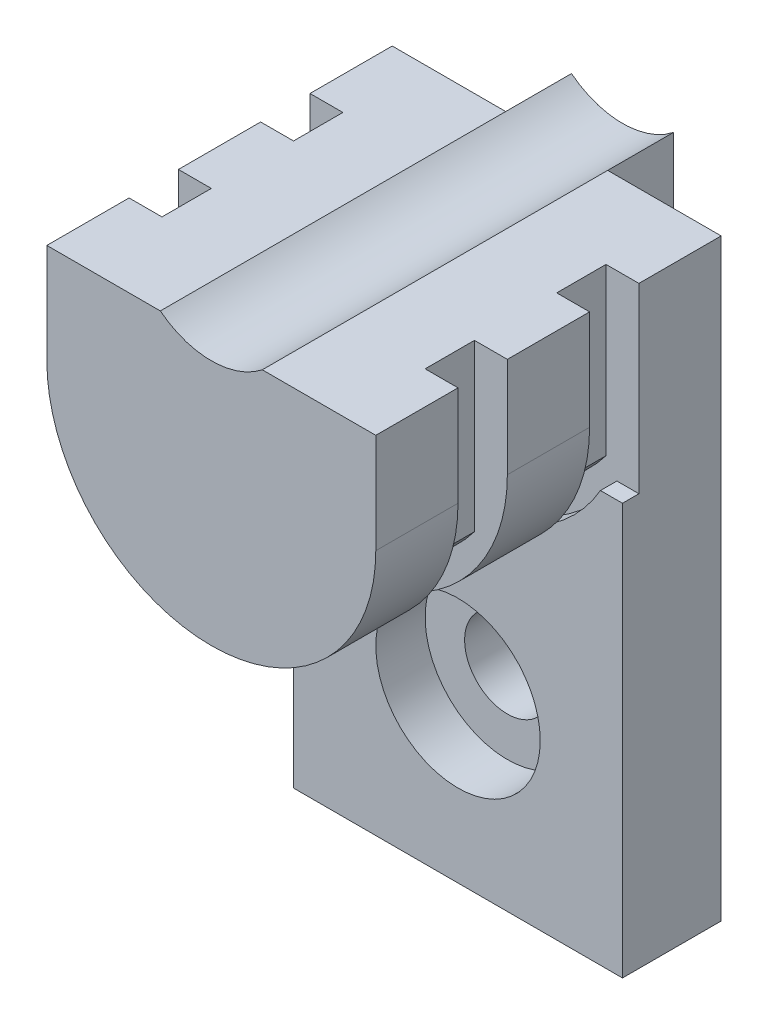
ISO-10303-21;
HEADER;
FILE_DESCRIPTION(('STEP AP214'),'2;1');
FILE_NAME('part.step','',(''),(''),'','','');
FILE_SCHEMA(('AUTOMOTIVE_DESIGN { 1 0 10303 214 1 1 1 1 }'));
ENDSEC;
DATA;
#1=APPLICATION_CONTEXT('core data for automotive mechanical design processes');
#2=APPLICATION_PROTOCOL_DEFINITION('international standard','automotive_design',2000,#1);
#3=PRODUCT_CONTEXT('',#1,'mechanical');
#4=PRODUCT('Part','Part','',(#3));
#5=PRODUCT_RELATED_PRODUCT_CATEGORY('part','',(#4));
#6=PRODUCT_DEFINITION_FORMATION('','',#4);
#7=PRODUCT_DEFINITION_CONTEXT('part definition',#1,'design');
#8=PRODUCT_DEFINITION('design','',#6,#7);
#9=PRODUCT_DEFINITION_SHAPE('','',#8);
#10=(LENGTH_UNIT() NAMED_UNIT(*) SI_UNIT(.MILLI.,.METRE.));
#11=(NAMED_UNIT(*) PLANE_ANGLE_UNIT() SI_UNIT($,.RADIAN.));
#12=(NAMED_UNIT(*) SI_UNIT($,.STERADIAN.) SOLID_ANGLE_UNIT());
#13=UNCERTAINTY_MEASURE_WITH_UNIT(LENGTH_MEASURE(1.E-05),#10,'distance_accuracy_value','');
#14=(GEOMETRIC_REPRESENTATION_CONTEXT(3) GLOBAL_UNCERTAINTY_ASSIGNED_CONTEXT((#13)) GLOBAL_UNIT_ASSIGNED_CONTEXT((#10,
#11,#12)) REPRESENTATION_CONTEXT('',''));
#15=CARTESIAN_POINT('',(0.,0.,0.));
#16=DIRECTION('',(0.,0.,1.));
#17=DIRECTION('',(1.,0.,0.));
#18=AXIS2_PLACEMENT_3D('',#15,#16,#17);
#19=CARTESIAN_POINT('',(-10.,0.,10.));
#20=DIRECTION('',(-1.,0.,0.));
#21=DIRECTION('',(0.,0.,1.));
#22=AXIS2_PLACEMENT_3D('',#19,#20,#21);
#23=PLANE('',#22);
#24=DIRECTION('',(0.,0.,-1.));
#25=VECTOR('',#24,1.);
#26=CARTESIAN_POINT('',(-9.99999999999999,-9.9230090491866,94.));
#27=LINE('',#26,#25);
#28=CARTESIAN_POINT('',(-10.,-9.9230090491866,17.));
#29=VERTEX_POINT('',#28);
#30=CARTESIAN_POINT('',(-10.,-9.9230090491866,12.));
#31=VERTEX_POINT('',#30);
#32=EDGE_CURVE('E954',#29,#31,#27,.T.);
#33=ORIENTED_EDGE('',*,*,#32,.T.);
#34=DIRECTION('',(0.,-1.,0.));
#35=VECTOR('',#34,1.);
#36=CARTESIAN_POINT('',(-10.,-14.0000000000001,12.));
#37=LINE('',#36,#35);
#38=CARTESIAN_POINT('',(-10.,-16.0000000000001,12.));
#39=VERTEX_POINT('',#38);
#40=EDGE_CURVE('E891',#31,#39,#37,.T.);
#41=ORIENTED_EDGE('',*,*,#40,.T.);
#42=DIRECTION('',(0.,0.,1.));
#43=VECTOR('',#42,1.);
#44=CARTESIAN_POINT('',(-10.,-16.0000000000001,12.));
#45=LINE('',#44,#43);
#46=CARTESIAN_POINT('',(-10.,-16.0000000000001,17.));
#47=VERTEX_POINT('',#46);
#48=EDGE_CURVE('E893',#39,#47,#45,.T.);
#49=ORIENTED_EDGE('',*,*,#48,.T.);
#50=DIRECTION('',(0.,1.,0.));
#51=VECTOR('',#50,1.);
#52=CARTESIAN_POINT('',(-10.,-16.,17.));
#53=LINE('',#52,#51);
#54=EDGE_CURVE('E880',#47,#29,#53,.T.);
#55=ORIENTED_EDGE('',*,*,#54,.T.);
#56=EDGE_LOOP('',(#33,#41,#49,#55));
#57=FACE_BOUND('',#56,.T.);
#58=ADVANCED_FACE('F445',(#57),#23,.T.);
#59=CARTESIAN_POINT('',(-10.,-9.9230090491866,9.00000000000002));
#60=VERTEX_POINT('',#59);
#61=CARTESIAN_POINT('',(-10.,-9.9230090491866,4.));
#62=VERTEX_POINT('',#61);
#63=EDGE_CURVE('E956',#60,#62,#27,.T.);
#64=ORIENTED_EDGE('',*,*,#63,.T.);
#65=DIRECTION('',(0.,1.,0.));
#66=VECTOR('',#65,1.);
#67=CARTESIAN_POINT('',(-10.,-22.,4.));
#68=LINE('',#67,#66);
#69=CARTESIAN_POINT('',(-10.,-46.,4.));
#70=VERTEX_POINT('',#69);
#71=EDGE_CURVE('E695',#70,#62,#68,.T.);
#72=ORIENTED_EDGE('',*,*,#71,.F.);
#73=DIRECTION('',(0.,0.,-1.));
#74=VECTOR('',#73,1.);
#75=CARTESIAN_POINT('',(-10.,-46.,10.));
#76=LINE('',#75,#74);
#77=CARTESIAN_POINT('',(-10.,-46.,10.));
#78=VERTEX_POINT('',#77);
#79=EDGE_CURVE('E713',#78,#70,#76,.T.);
#80=ORIENTED_EDGE('',*,*,#79,.F.);
#81=DIRECTION('',(0.,1.,0.));
#82=VECTOR('',#81,1.);
#83=CARTESIAN_POINT('',(-10.,-16.,10.));
#84=LINE('',#83,#82);
#85=CARTESIAN_POINT('',(-10.,-21.,10.));
#86=VERTEX_POINT('',#85);
#87=EDGE_CURVE('E685',#78,#86,#84,.T.);
#88=ORIENTED_EDGE('',*,*,#87,.T.);
#89=DIRECTION('',(0.,0.,1.));
#90=VECTOR('',#89,1.);
#91=CARTESIAN_POINT('',(-10.,-21.,0.));
#92=LINE('',#91,#90);
#93=CARTESIAN_POINT('',(-10.,-21.,9.));
#94=VERTEX_POINT('',#93);
#95=EDGE_CURVE('E823',#94,#86,#92,.T.);
#96=ORIENTED_EDGE('',*,*,#95,.F.);
#97=DIRECTION('',(0.,-1.,0.));
#98=VECTOR('',#97,1.);
#99=CARTESIAN_POINT('',(-10.,-14.,9.));
#100=LINE('',#99,#98);
#101=EDGE_CURVE('E907',#60,#94,#100,.T.);
#102=ORIENTED_EDGE('',*,*,#101,.F.);
#103=EDGE_LOOP('',(#64,#72,#80,#88,#96,#102));
#104=FACE_BOUND('',#103,.T.);
#105=ADVANCED_FACE('F931',(#104),#23,.T.);
#106=CARTESIAN_POINT('',(-9.99999999999999,-9.9230090491866,25.));
#107=VERTEX_POINT('',#106);
#108=CARTESIAN_POINT('',(-9.99999999999999,-9.9230090491866,20.));
#109=VERTEX_POINT('',#108);
#110=EDGE_CURVE('E951',#107,#109,#27,.T.);
#111=ORIENTED_EDGE('',*,*,#110,.T.);
#112=DIRECTION('',(0.,-1.,0.));
#113=VECTOR('',#112,1.);
#114=CARTESIAN_POINT('',(-10.,-14.,20.));
#115=LINE('',#114,#113);
#116=CARTESIAN_POINT('',(-10.,-16.,20.));
#117=VERTEX_POINT('',#116);
#118=EDGE_CURVE('E858',#109,#117,#115,.T.);
#119=ORIENTED_EDGE('',*,*,#118,.T.);
#120=DIRECTION('',(0.,0.,1.));
#121=VECTOR('',#120,1.);
#122=CARTESIAN_POINT('',(-10.,-16.,20.));
#123=LINE('',#122,#121);
#124=CARTESIAN_POINT('',(-10.,-16.,25.));
#125=VERTEX_POINT('',#124);
#126=EDGE_CURVE('E865',#117,#125,#123,.T.);
#127=ORIENTED_EDGE('',*,*,#126,.T.);
#128=DIRECTION('',(0.,-1.,0.));
#129=VECTOR('',#128,1.);
#130=CARTESIAN_POINT('',(-10.,-6.,25.));
#131=LINE('',#130,#129);
#132=EDGE_CURVE('E735',#107,#125,#131,.T.);
#133=ORIENTED_EDGE('',*,*,#132,.F.);
#134=EDGE_LOOP('',(#111,#119,#127,#133));
#135=FACE_BOUND('',#134,.T.);
#136=ADVANCED_FACE('F934',(#135),#23,.T.);
#137=CARTESIAN_POINT('',(10.,0.,4.));
#138=DIRECTION('',(1.,0.,0.));
#139=DIRECTION('',(0.,0.,-1.));
#140=AXIS2_PLACEMENT_3D('',#137,#138,#139);
#141=PLANE('',#140);
#142=DIRECTION('',(0.,0.,-1.));
#143=VECTOR('',#142,1.);
#144=CARTESIAN_POINT('',(10.,-9.9230090491866,94.));
#145=LINE('',#144,#143);
#146=CARTESIAN_POINT('',(10.,-9.9230090491866,17.));
#147=VERTEX_POINT('',#146);
#148=CARTESIAN_POINT('',(10.,-9.9230090491866,12.));
#149=VERTEX_POINT('',#148);
#150=EDGE_CURVE('E667',#147,#149,#145,.T.);
#151=ORIENTED_EDGE('',*,*,#150,.F.);
#152=DIRECTION('',(0.,-1.,0.));
#153=VECTOR('',#152,1.);
#154=CARTESIAN_POINT('',(9.99999999999999,-14.,17.));
#155=LINE('',#154,#153);
#156=CARTESIAN_POINT('',(9.99999999999999,-16.,17.));
#157=VERTEX_POINT('',#156);
#158=EDGE_CURVE('E876',#147,#157,#155,.T.);
#159=ORIENTED_EDGE('',*,*,#158,.T.);
#160=DIRECTION('',(0.,0.,1.));
#161=VECTOR('',#160,1.);
#162=CARTESIAN_POINT('',(9.99999999999999,-16.,12.));
#163=LINE('',#162,#161);
#164=CARTESIAN_POINT('',(9.99999999999999,-16.,12.));
#165=VERTEX_POINT('',#164);
#166=EDGE_CURVE('E896',#165,#157,#163,.T.);
#167=ORIENTED_EDGE('',*,*,#166,.F.);
#168=DIRECTION('',(0.,-1.,0.));
#169=VECTOR('',#168,1.);
#170=CARTESIAN_POINT('',(10.,-14.,12.));
#171=LINE('',#170,#169);
#172=EDGE_CURVE('E886',#149,#165,#171,.T.);
#173=ORIENTED_EDGE('',*,*,#172,.F.);
#174=EDGE_LOOP('',(#151,#159,#167,#173));
#175=FACE_BOUND('',#174,.T.);
#176=ADVANCED_FACE('F942',(#175),#141,.T.);
#177=CARTESIAN_POINT('',(10.,-9.9230090491866,25.));
#178=VERTEX_POINT('',#177);
#179=CARTESIAN_POINT('',(10.,-9.9230090491866,20.));
#180=VERTEX_POINT('',#179);
#181=EDGE_CURVE('E669',#178,#180,#145,.T.);
#182=ORIENTED_EDGE('',*,*,#181,.F.);
#183=DIRECTION('',(0.,-1.,0.));
#184=VECTOR('',#183,1.);
#185=CARTESIAN_POINT('',(10.,-6.,25.));
#186=LINE('',#185,#184);
#187=CARTESIAN_POINT('',(9.99999999999999,-16.,25.));
#188=VERTEX_POINT('',#187);
#189=EDGE_CURVE('E910',#178,#188,#186,.T.);
#190=ORIENTED_EDGE('',*,*,#189,.T.);
#191=DIRECTION('',(0.,0.,1.));
#192=VECTOR('',#191,1.);
#193=CARTESIAN_POINT('',(9.99999999999999,-16.,20.));
#194=LINE('',#193,#192);
#195=CARTESIAN_POINT('',(9.99999999999999,-16.,20.));
#196=VERTEX_POINT('',#195);
#197=EDGE_CURVE('E868',#196,#188,#194,.T.);
#198=ORIENTED_EDGE('',*,*,#197,.F.);
#199=DIRECTION('',(0.,-1.,0.));
#200=VECTOR('',#199,1.);
#201=CARTESIAN_POINT('',(9.99999999999999,-14.,20.));
#202=LINE('',#201,#200);
#203=EDGE_CURVE('E863',#180,#196,#202,.T.);
#204=ORIENTED_EDGE('',*,*,#203,.F.);
#205=EDGE_LOOP('',(#182,#190,#198,#204));
#206=FACE_BOUND('',#205,.T.);
#207=ADVANCED_FACE('F947',(#206),#141,.T.);
#208=CARTESIAN_POINT('',(0.,0.,10.));
#209=DIRECTION('',(0.,0.,1.));
#210=DIRECTION('',(1.,0.,0.));
#211=AXIS2_PLACEMENT_3D('',#208,#209,#210);
#212=PLANE('',#211);
#213=CARTESIAN_POINT('',(0.,-36.,10.));
#214=DIRECTION('',(0.,0.,1.));
#215=DIRECTION('',(1.,0.,0.));
#216=AXIS2_PLACEMENT_3D('',#213,#214,#215);
#217=CIRCLE('',#216,5.);
#218=CARTESIAN_POINT('',(5.,-36.,10.));
#219=VERTEX_POINT('',#218);
#220=EDGE_CURVE('E757',#219,#219,#217,.T.);
#221=ORIENTED_EDGE('',*,*,#220,.F.);
#222=EDGE_LOOP('',(#221));
#223=FACE_BOUND('',#222,.T.);
#224=DIRECTION('',(0.,1.,0.));
#225=VECTOR('',#224,1.);
#226=CARTESIAN_POINT('',(10.,-16.,10.));
#227=LINE('',#226,#225);
#228=CARTESIAN_POINT('',(9.99999999999999,-46.,9.99999999999999));
#229=VERTEX_POINT('',#228);
#230=CARTESIAN_POINT('',(10.,-21.,10.));
#231=VERTEX_POINT('',#230);
#232=EDGE_CURVE('E699',#229,#231,#227,.T.);
#233=ORIENTED_EDGE('',*,*,#232,.T.);
#234=DIRECTION('',(-1.,0.,0.));
#235=VECTOR('',#234,1.);
#236=CARTESIAN_POINT('',(0.,-21.,10.));
#237=LINE('',#236,#235);
#238=CARTESIAN_POINT('',(8.66025403784438,-21.,10.));
#239=VERTEX_POINT('',#238);
#240=EDGE_CURVE('E846',#231,#239,#237,.T.);
#241=ORIENTED_EDGE('',*,*,#240,.T.);
#242=CARTESIAN_POINT('',(0.,-16.,10.));
#243=DIRECTION('',(0.,0.,1.));
#244=DIRECTION('',(1.,0.,0.));
#245=AXIS2_PLACEMENT_3D('',#242,#243,#244);
#246=CIRCLE('',#245,10.);
#247=CARTESIAN_POINT('',(-8.66025403784439,-21.,10.));
#248=VERTEX_POINT('',#247);
#249=EDGE_CURVE('E909',#248,#239,#246,.T.);
#250=ORIENTED_EDGE('',*,*,#249,.F.);
#251=DIRECTION('',(-1.,0.,0.));
#252=VECTOR('',#251,1.);
#253=CARTESIAN_POINT('',(0.,-21.,10.));
#254=LINE('',#253,#252);
#255=EDGE_CURVE('E838',#248,#86,#254,.T.);
#256=ORIENTED_EDGE('',*,*,#255,.T.);
#257=ORIENTED_EDGE('',*,*,#87,.F.);
#258=DIRECTION('',(1.,0.,0.));
#259=VECTOR('',#258,1.);
#260=CARTESIAN_POINT('',(-10.,-46.,10.));
#261=LINE('',#260,#259);
#262=EDGE_CURVE('E688',#78,#229,#261,.T.);
#263=ORIENTED_EDGE('',*,*,#262,.T.);
#264=EDGE_LOOP('',(#233,#241,#250,#256,#257,#263));
#265=FACE_BOUND('',#264,.T.);
#266=ADVANCED_FACE('F1033',(#223,#265),#212,.T.);
#267=CARTESIAN_POINT('',(0.,-16.,9.));
#268=DIRECTION('',(0.,0.,1.));
#269=DIRECTION('',(1.,0.,0.));
#270=AXIS2_PLACEMENT_3D('',#267,#268,#269);
#271=CYLINDRICAL_SURFACE('',#270,10.);
#272=DIRECTION('',(0.,0.,1.));
#273=VECTOR('',#272,1.);
#274=CARTESIAN_POINT('',(8.66025403784438,-21.,9.));
#275=LINE('',#274,#273);
#276=CARTESIAN_POINT('',(8.66025403784438,-21.,9.));
#277=VERTEX_POINT('',#276);
#278=EDGE_CURVE('E844',#277,#239,#275,.T.);
#279=ORIENTED_EDGE('',*,*,#278,.F.);
#280=CARTESIAN_POINT('',(0.,-16.,9.));
#281=DIRECTION('',(0.,0.,1.));
#282=DIRECTION('',(1.,0.,0.));
#283=AXIS2_PLACEMENT_3D('',#280,#281,#282);
#284=CIRCLE('',#283,10.);
#285=CARTESIAN_POINT('',(-8.66025403784439,-21.,9.));
#286=VERTEX_POINT('',#285);
#287=EDGE_CURVE('E899',#286,#277,#284,.T.);
#288=ORIENTED_EDGE('',*,*,#287,.F.);
#289=DIRECTION('',(0.,0.,1.));
#290=VECTOR('',#289,1.);
#291=CARTESIAN_POINT('',(-8.66025403784439,-21.,9.));
#292=LINE('',#291,#290);
#293=EDGE_CURVE('E836',#248,#286,#292,.F.);
#294=ORIENTED_EDGE('',*,*,#293,.F.);
#295=ORIENTED_EDGE('',*,*,#249,.T.);
#296=EDGE_LOOP('',(#279,#288,#294,#295));
#297=FACE_BOUND('',#296,.T.);
#298=ADVANCED_FACE('F1036',(#297),#271,.F.);
#299=CARTESIAN_POINT('',(0.,-14.,17.));
#300=DIRECTION('',(0.,0.,1.));
#301=DIRECTION('',(1.,0.,0.));
#302=AXIS2_PLACEMENT_3D('',#299,#300,#301);
#303=CYLINDRICAL_SURFACE('',#302,10.);
#304=CARTESIAN_POINT('',(0.,-14.,20.));
#305=DIRECTION('',(0.,0.,-1.));
#306=DIRECTION('',(-1.,0.,0.));
#307=AXIS2_PLACEMENT_3D('',#304,#305,#306);
#308=CIRCLE('',#307,10.);
#309=CARTESIAN_POINT('',(8.,-20.,20.));
#310=VERTEX_POINT('',#309);
#311=CARTESIAN_POINT('',(-8.,-20.,20.));
#312=VERTEX_POINT('',#311);
#313=EDGE_CURVE('E855',#310,#312,#308,.T.);
#314=ORIENTED_EDGE('',*,*,#313,.T.);
#315=DIRECTION('',(0.,0.,1.));
#316=VECTOR('',#315,1.);
#317=CARTESIAN_POINT('',(-8.,-20.,17.));
#318=LINE('',#317,#316);
#319=CARTESIAN_POINT('',(-8.,-20.,17.));
#320=VERTEX_POINT('',#319);
#321=EDGE_CURVE('E833',#312,#320,#318,.F.);
#322=ORIENTED_EDGE('',*,*,#321,.T.);
#323=CARTESIAN_POINT('',(0.,-14.,17.));
#324=DIRECTION('',(0.,0.,1.));
#325=DIRECTION('',(1.,0.,0.));
#326=AXIS2_PLACEMENT_3D('',#323,#324,#325);
#327=CIRCLE('',#326,10.);
#328=CARTESIAN_POINT('',(8.,-20.,17.));
#329=VERTEX_POINT('',#328);
#330=EDGE_CURVE('E871',#320,#329,#327,.T.);
#331=ORIENTED_EDGE('',*,*,#330,.T.);
#332=DIRECTION('',(0.,0.,1.));
#333=VECTOR('',#332,1.);
#334=CARTESIAN_POINT('',(8.,-20.,17.));
#335=LINE('',#334,#333);
#336=EDGE_CURVE('E829',#310,#329,#335,.F.);
#337=ORIENTED_EDGE('',*,*,#336,.F.);
#338=EDGE_LOOP('',(#314,#322,#331,#337));
#339=FACE_BOUND('',#338,.T.);
#340=ADVANCED_FACE('F1092',(#339),#303,.T.);
#341=CARTESIAN_POINT('',(0.,-6.,25.));
#342=DIRECTION('',(0.,0.,1.));
#343=DIRECTION('',(1.,0.,0.));
#344=AXIS2_PLACEMENT_3D('',#341,#342,#343);
#345=PLANE('',#344);
#346=DIRECTION('',(1.,0.,0.));
#347=VECTOR('',#346,1.);
#348=CARTESIAN_POINT('',(0.,-9.9230090491866,25.));
#349=LINE('',#348,#347);
#350=CARTESIAN_POINT('',(-3.1,-9.9230090491866,25.));
#351=VERTEX_POINT('',#350);
#352=EDGE_CURVE('E974',#107,#351,#349,.T.);
#353=ORIENTED_EDGE('',*,*,#352,.F.);
#354=ORIENTED_EDGE('',*,*,#132,.T.);
#355=CARTESIAN_POINT('',(0.,-16.,25.));
#356=DIRECTION('',(0.,0.,-1.));
#357=DIRECTION('',(-1.,0.,0.));
#358=AXIS2_PLACEMENT_3D('',#355,#356,#357);
#359=CIRCLE('',#358,9.99999999999999);
#360=EDGE_CURVE('E854',#188,#125,#359,.T.);
#361=ORIENTED_EDGE('',*,*,#360,.F.);
#362=ORIENTED_EDGE('',*,*,#189,.F.);
#363=CARTESIAN_POINT('',(3.10000000000001,-9.9230090491866,25.));
#364=VERTEX_POINT('',#363);
#365=EDGE_CURVE('E797',#364,#178,#349,.T.);
#366=ORIENTED_EDGE('',*,*,#365,.F.);
#367=CARTESIAN_POINT('',(0.,-6.,25.));
#368=DIRECTION('',(0.,0.,1.));
#369=DIRECTION('',(1.,0.,0.));
#370=AXIS2_PLACEMENT_3D('',#367,#368,#369);
#371=CIRCLE('',#370,5.);
#372=EDGE_CURVE('E852',#351,#364,#371,.T.);
#373=ORIENTED_EDGE('',*,*,#372,.F.);
#374=EDGE_LOOP('',(#353,#354,#361,#362,#366,#373));
#375=FACE_BOUND('',#374,.T.);
#376=ADVANCED_FACE('F972',(#375),#345,.T.);
#377=CARTESIAN_POINT('',(0.,-16.,12.));
#378=DIRECTION('',(0.,0.,1.));
#379=DIRECTION('',(1.,0.,0.));
#380=AXIS2_PLACEMENT_3D('',#377,#378,#379);
#381=CYLINDRICAL_SURFACE('',#380,9.99999999999999);
#382=ORIENTED_EDGE('',*,*,#166,.T.);
#383=CARTESIAN_POINT('',(0.,-16.,17.));
#384=DIRECTION('',(0.,0.,-1.));
#385=DIRECTION('',(-1.,0.,0.));
#386=AXIS2_PLACEMENT_3D('',#383,#384,#385);
#387=CIRCLE('',#386,9.99999999999999);
#388=EDGE_CURVE('E878',#157,#47,#387,.T.);
#389=ORIENTED_EDGE('',*,*,#388,.T.);
#390=ORIENTED_EDGE('',*,*,#48,.F.);
#391=CARTESIAN_POINT('',(0.,-16.,12.));
#392=DIRECTION('',(0.,0.,1.));
#393=DIRECTION('',(1.,0.,0.));
#394=AXIS2_PLACEMENT_3D('',#391,#392,#393);
#395=CIRCLE('',#394,9.99999999999999);
#396=EDGE_CURVE('E888',#39,#165,#395,.T.);
#397=ORIENTED_EDGE('',*,*,#396,.T.);
#398=EDGE_LOOP('',(#382,#389,#390,#397));
#399=FACE_BOUND('',#398,.T.);
#400=ADVANCED_FACE('F1010',(#399),#381,.T.);
#401=CARTESIAN_POINT('',(0.,-14.,9.));
#402=DIRECTION('',(0.,0.,1.));
#403=DIRECTION('',(1.,0.,0.));
#404=AXIS2_PLACEMENT_3D('',#401,#402,#403);
#405=CYLINDRICAL_SURFACE('',#404,10.);
#406=CARTESIAN_POINT('',(0.,-14.,9.));
#407=DIRECTION('',(0.,0.,-1.));
#408=DIRECTION('',(-1.,0.,0.));
#409=AXIS2_PLACEMENT_3D('',#406,#407,#408);
#410=CIRCLE('',#409,10.);
#411=CARTESIAN_POINT('',(8.,-20.,9.));
#412=VERTEX_POINT('',#411);
#413=CARTESIAN_POINT('',(-8.,-20.,9.));
#414=VERTEX_POINT('',#413);
#415=EDGE_CURVE('E904',#412,#414,#410,.T.);
#416=ORIENTED_EDGE('',*,*,#415,.F.);
#417=DIRECTION('',(0.,0.,1.));
#418=VECTOR('',#417,1.);
#419=CARTESIAN_POINT('',(8.,-20.,9.));
#420=LINE('',#419,#418);
#421=CARTESIAN_POINT('',(8.,-20.,12.));
#422=VERTEX_POINT('',#421);
#423=EDGE_CURVE('E849',#412,#422,#420,.T.);
#424=ORIENTED_EDGE('',*,*,#423,.T.);
#425=CARTESIAN_POINT('',(0.,-14.,12.));
#426=DIRECTION('',(0.,0.,1.));
#427=DIRECTION('',(1.,0.,0.));
#428=AXIS2_PLACEMENT_3D('',#425,#426,#427);
#429=CIRCLE('',#428,10.);
#430=CARTESIAN_POINT('',(-8.,-20.,12.));
#431=VERTEX_POINT('',#430);
#432=EDGE_CURVE('E883',#431,#422,#429,.T.);
#433=ORIENTED_EDGE('',*,*,#432,.F.);
#434=DIRECTION('',(0.,0.,1.));
#435=VECTOR('',#434,1.);
#436=CARTESIAN_POINT('',(-8.,-20.,9.));
#437=LINE('',#436,#435);
#438=EDGE_CURVE('E841',#431,#414,#437,.F.);
#439=ORIENTED_EDGE('',*,*,#438,.T.);
#440=EDGE_LOOP('',(#416,#424,#433,#439));
#441=FACE_BOUND('',#440,.T.);
#442=ADVANCED_FACE('F1023',(#441),#405,.T.);
#443=CARTESIAN_POINT('',(10.,-9.9230090491866,9.00000000000002));
#444=VERTEX_POINT('',#443);
#445=CARTESIAN_POINT('',(10.,-9.9230090491866,4.));
#446=VERTEX_POINT('',#445);
#447=EDGE_CURVE('E657',#444,#446,#145,.T.);
#448=ORIENTED_EDGE('',*,*,#447,.F.);
#449=DIRECTION('',(0.,1.,0.));
#450=VECTOR('',#449,1.);
#451=CARTESIAN_POINT('',(10.,-14.,9.));
#452=LINE('',#451,#450);
#453=CARTESIAN_POINT('',(10.,-21.,9.));
#454=VERTEX_POINT('',#453);
#455=EDGE_CURVE('E902',#454,#444,#452,.T.);
#456=ORIENTED_EDGE('',*,*,#455,.F.);
#457=DIRECTION('',(0.,0.,-1.));
#458=VECTOR('',#457,1.);
#459=CARTESIAN_POINT('',(10.,-21.,0.));
#460=LINE('',#459,#458);
#461=EDGE_CURVE('E813',#231,#454,#460,.T.);
#462=ORIENTED_EDGE('',*,*,#461,.F.);
#463=ORIENTED_EDGE('',*,*,#232,.F.);
#464=DIRECTION('',(0.,0.,-1.));
#465=VECTOR('',#464,1.);
#466=CARTESIAN_POINT('',(9.99999999999999,-46.,9.99999999999999));
#467=LINE('',#466,#465);
#468=CARTESIAN_POINT('',(9.99999999999999,-46.,4.));
#469=VERTEX_POINT('',#468);
#470=EDGE_CURVE('E684',#229,#469,#467,.T.);
#471=ORIENTED_EDGE('',*,*,#470,.T.);
#472=DIRECTION('',(0.,1.,0.));
#473=VECTOR('',#472,1.);
#474=CARTESIAN_POINT('',(10.,0.,4.));
#475=LINE('',#474,#473);
#476=EDGE_CURVE('E676',#469,#446,#475,.T.);
#477=ORIENTED_EDGE('',*,*,#476,.T.);
#478=EDGE_LOOP('',(#448,#456,#462,#463,#471,#477));
#479=FACE_BOUND('',#478,.T.);
#480=ADVANCED_FACE('F682',(#479),#141,.T.);
#481=CARTESIAN_POINT('',(0.,0.,0.));
#482=DIRECTION('',(0.,0.,1.));
#483=DIRECTION('',(1.,0.,0.));
#484=AXIS2_PLACEMENT_3D('',#481,#482,#483);
#485=PLANE('',#484);
#486=DIRECTION('',(0.,1.,0.));
#487=VECTOR('',#486,1.);
#488=CARTESIAN_POINT('',(-3.1,-22.,0.));
#489=LINE('',#488,#487);
#490=CARTESIAN_POINT('',(-3.1,-32.9,0.));
#491=VERTEX_POINT('',#490);
#492=CARTESIAN_POINT('',(-3.1,-9.9230090491866,0.));
#493=VERTEX_POINT('',#492);
#494=EDGE_CURVE('E705',#491,#493,#489,.T.);
#495=ORIENTED_EDGE('',*,*,#494,.T.);
#496=CARTESIAN_POINT('',(0.,-6.,0.));
#497=DIRECTION('',(0.,0.,1.));
#498=DIRECTION('',(1.,0.,0.));
#499=AXIS2_PLACEMENT_3D('',#496,#497,#498);
#500=CIRCLE('',#499,5.);
#501=CARTESIAN_POINT('',(3.1,-9.92300904918661,0.));
#502=VERTEX_POINT('',#501);
#503=EDGE_CURVE('E772',#493,#502,#500,.T.);
#504=ORIENTED_EDGE('',*,*,#503,.T.);
#505=DIRECTION('',(0.,1.,0.));
#506=VECTOR('',#505,1.);
#507=CARTESIAN_POINT('',(3.1,-22.,0.));
#508=LINE('',#507,#506);
#509=CARTESIAN_POINT('',(3.1,-32.9,0.));
#510=VERTEX_POINT('',#509);
#511=EDGE_CURVE('E724',#510,#502,#508,.T.);
#512=ORIENTED_EDGE('',*,*,#511,.F.);
#513=DIRECTION('',(-1.,0.,0.));
#514=VECTOR('',#513,1.);
#515=CARTESIAN_POINT('',(0.,-32.9,0.));
#516=LINE('',#515,#514);
#517=EDGE_CURVE('E725',#510,#491,#516,.T.);
#518=ORIENTED_EDGE('',*,*,#517,.T.);
#519=EDGE_LOOP('',(#495,#504,#512,#518));
#520=FACE_BOUND('',#519,.T.);
#521=ADVANCED_FACE('F785',(#520),#485,.F.);
#522=CARTESIAN_POINT('',(0.,-22.,4.));
#523=DIRECTION('',(0.,0.,-1.));
#524=DIRECTION('',(-1.,0.,0.));
#525=AXIS2_PLACEMENT_3D('',#522,#523,#524);
#526=PLANE('',#525);
#527=DIRECTION('',(-1.,0.,0.));
#528=VECTOR('',#527,1.);
#529=CARTESIAN_POINT('',(-3.1,-9.9230090491866,4.));
#530=LINE('',#529,#528);
#531=CARTESIAN_POINT('',(3.1,-9.9230090491866,4.));
#532=VERTEX_POINT('',#531);
#533=EDGE_CURVE('E660',#446,#532,#530,.T.);
#534=ORIENTED_EDGE('',*,*,#533,.F.);
#535=ORIENTED_EDGE('',*,*,#476,.F.);
#536=DIRECTION('',(1.,0.,0.));
#537=VECTOR('',#536,1.);
#538=CARTESIAN_POINT('',(-10.,-46.,4.));
#539=LINE('',#538,#537);
#540=CARTESIAN_POINT('',(3.1,-46.,4.));
#541=VERTEX_POINT('',#540);
#542=EDGE_CURVE('E711',#541,#469,#539,.T.);
#543=ORIENTED_EDGE('',*,*,#542,.F.);
#544=DIRECTION('',(0.,-1.,0.));
#545=VECTOR('',#544,1.);
#546=CARTESIAN_POINT('',(3.1,0.,4.));
#547=LINE('',#546,#545);
#548=CARTESIAN_POINT('',(3.1,-39.1,4.));
#549=VERTEX_POINT('',#548);
#550=EDGE_CURVE('E736',#549,#541,#547,.T.);
#551=ORIENTED_EDGE('',*,*,#550,.F.);
#552=DIRECTION('',(-1.,0.,0.));
#553=VECTOR('',#552,1.);
#554=CARTESIAN_POINT('',(0.,-39.1,4.));
#555=LINE('',#554,#553);
#556=CARTESIAN_POINT('',(-3.1,-39.1,4.));
#557=VERTEX_POINT('',#556);
#558=EDGE_CURVE('E732',#549,#557,#555,.T.);
#559=ORIENTED_EDGE('',*,*,#558,.T.);
#560=DIRECTION('',(0.,-1.,0.));
#561=VECTOR('',#560,1.);
#562=CARTESIAN_POINT('',(-3.1,0.,4.));
#563=LINE('',#562,#561);
#564=CARTESIAN_POINT('',(-3.1,-46.,4.));
#565=VERTEX_POINT('',#564);
#566=EDGE_CURVE('E697',#557,#565,#563,.T.);
#567=ORIENTED_EDGE('',*,*,#566,.T.);
#568=EDGE_CURVE('E708',#70,#565,#539,.T.);
#569=ORIENTED_EDGE('',*,*,#568,.F.);
#570=ORIENTED_EDGE('',*,*,#71,.T.);
#571=CARTESIAN_POINT('',(-3.1,-9.9230090491866,4.));
#572=VERTEX_POINT('',#571);
#573=EDGE_CURVE('E680',#572,#62,#530,.T.);
#574=ORIENTED_EDGE('',*,*,#573,.F.);
#575=DIRECTION('',(0.,1.,0.));
#576=VECTOR('',#575,1.);
#577=CARTESIAN_POINT('',(-3.1,-22.,4.));
#578=LINE('',#577,#576);
#579=CARTESIAN_POINT('',(-3.1,-32.9,4.));
#580=VERTEX_POINT('',#579);
#581=EDGE_CURVE('E693',#580,#572,#578,.T.);
#582=ORIENTED_EDGE('',*,*,#581,.F.);
#583=DIRECTION('',(-1.,0.,0.));
#584=VECTOR('',#583,1.);
#585=CARTESIAN_POINT('',(0.,-32.9,4.));
#586=LINE('',#585,#584);
#587=CARTESIAN_POINT('',(3.1,-32.9,4.));
#588=VERTEX_POINT('',#587);
#589=EDGE_CURVE('E716',#588,#580,#586,.T.);
#590=ORIENTED_EDGE('',*,*,#589,.F.);
#591=DIRECTION('',(0.,1.,0.));
#592=VECTOR('',#591,1.);
#593=CARTESIAN_POINT('',(3.1,-22.,4.));
#594=LINE('',#593,#592);
#595=EDGE_CURVE('E679',#588,#532,#594,.T.);
#596=ORIENTED_EDGE('',*,*,#595,.T.);
#597=EDGE_LOOP('',(#534,#535,#543,#551,#559,#567,#569,#570,#574,#582,#590,#596));
#598=FACE_BOUND('',#597,.T.);
#599=CARTESIAN_POINT('',(0.,-36.,4.));
#600=DIRECTION('',(0.,0.,-1.));
#601=DIRECTION('',(-1.,0.,0.));
#602=AXIS2_PLACEMENT_3D('',#599,#600,#601);
#603=CIRCLE('',#602,2.6);
#604=CARTESIAN_POINT('',(-2.6,-36.,4.));
#605=VERTEX_POINT('',#604);
#606=EDGE_CURVE('E702',#605,#605,#603,.T.);
#607=ORIENTED_EDGE('',*,*,#606,.F.);
#608=EDGE_LOOP('',(#607));
#609=FACE_BOUND('',#608,.T.);
#610=ADVANCED_FACE('F673',(#598,#609),#526,.T.);
#611=CARTESIAN_POINT('',(0.,-36.,10.));
#612=DIRECTION('',(0.,0.,-1.));
#613=DIRECTION('',(-1.,0.,0.));
#614=AXIS2_PLACEMENT_3D('',#611,#612,#613);
#615=CYLINDRICAL_SURFACE('',#614,2.6);
#616=ORIENTED_EDGE('',*,*,#606,.T.);
#617=EDGE_LOOP('',(#616));
#618=FACE_BOUND('',#617,.T.);
#619=CARTESIAN_POINT('',(0.,-36.,7.));
#620=DIRECTION('',(0.,0.,1.));
#621=DIRECTION('',(1.,0.,0.));
#622=AXIS2_PLACEMENT_3D('',#619,#620,#621);
#623=CIRCLE('',#622,2.6);
#624=CARTESIAN_POINT('',(2.6,-36.,7.));
#625=VERTEX_POINT('',#624);
#626=EDGE_CURVE('E760',#625,#625,#623,.F.);
#627=ORIENTED_EDGE('',*,*,#626,.F.);
#628=EDGE_LOOP('',(#627));
#629=FACE_BOUND('',#628,.T.);
#630=ADVANCED_FACE('F918',(#618,#629),#615,.F.);
#631=CARTESIAN_POINT('',(3.1,-22.,0.));
#632=DIRECTION('',(1.,0.,0.));
#633=DIRECTION('',(0.,0.,-1.));
#634=AXIS2_PLACEMENT_3D('',#631,#632,#633);
#635=PLANE('',#634);
#636=DIRECTION('',(0.,0.,1.));
#637=VECTOR('',#636,1.);
#638=CARTESIAN_POINT('',(3.1,-9.92300904918661,-5.));
#639=LINE('',#638,#637);
#640=EDGE_CURVE('E791',#532,#502,#639,.F.);
#641=ORIENTED_EDGE('',*,*,#640,.F.);
#642=ORIENTED_EDGE('',*,*,#595,.F.);
#643=DIRECTION('',(0.,0.,-1.));
#644=VECTOR('',#643,1.);
#645=CARTESIAN_POINT('',(3.1,-32.9,4.));
#646=LINE('',#645,#644);
#647=EDGE_CURVE('E721',#588,#510,#646,.T.);
#648=ORIENTED_EDGE('',*,*,#647,.T.);
#649=ORIENTED_EDGE('',*,*,#511,.T.);
#650=EDGE_LOOP('',(#641,#642,#648,#649));
#651=FACE_BOUND('',#650,.T.);
#652=ADVANCED_FACE('F790',(#651),#635,.T.);
#653=CARTESIAN_POINT('',(-3.1,-22.,0.));
#654=DIRECTION('',(-1.,0.,0.));
#655=DIRECTION('',(0.,0.,1.));
#656=AXIS2_PLACEMENT_3D('',#653,#654,#655);
#657=PLANE('',#656);
#658=DIRECTION('',(0.,0.,1.));
#659=VECTOR('',#658,1.);
#660=CARTESIAN_POINT('',(-3.1,-9.9230090491866,-5.));
#661=LINE('',#660,#659);
#662=EDGE_CURVE('E453',#493,#572,#661,.T.);
#663=ORIENTED_EDGE('',*,*,#662,.F.);
#664=ORIENTED_EDGE('',*,*,#494,.F.);
#665=DIRECTION('',(0.,0.,-1.));
#666=VECTOR('',#665,1.);
#667=CARTESIAN_POINT('',(-3.1,-32.9,4.));
#668=LINE('',#667,#666);
#669=EDGE_CURVE('E717',#580,#491,#668,.T.);
#670=ORIENTED_EDGE('',*,*,#669,.F.);
#671=ORIENTED_EDGE('',*,*,#581,.T.);
#672=EDGE_LOOP('',(#663,#664,#670,#671));
#673=FACE_BOUND('',#672,.T.);
#674=ADVANCED_FACE('F776',(#673),#657,.T.);
#675=CARTESIAN_POINT('',(-10.,-46.,10.));
#676=DIRECTION('',(0.,1.,0.));
#677=DIRECTION('',(0.,0.,1.));
#678=AXIS2_PLACEMENT_3D('',#675,#676,#677);
#679=PLANE('',#678);
#680=ORIENTED_EDGE('',*,*,#568,.T.);
#681=DIRECTION('',(0.,0.,-1.));
#682=VECTOR('',#681,1.);
#683=CARTESIAN_POINT('',(-3.1,-46.,4.));
#684=LINE('',#683,#682);
#685=CARTESIAN_POINT('',(-3.1,-46.,0.));
#686=VERTEX_POINT('',#685);
#687=EDGE_CURVE('E710',#565,#686,#684,.T.);
#688=ORIENTED_EDGE('',*,*,#687,.T.);
#689=DIRECTION('',(-1.,0.,0.));
#690=VECTOR('',#689,1.);
#691=CARTESIAN_POINT('',(0.,-46.,0.));
#692=LINE('',#691,#690);
#693=CARTESIAN_POINT('',(3.1,-46.,0.));
#694=VERTEX_POINT('',#693);
#695=EDGE_CURVE('E748',#694,#686,#692,.T.);
#696=ORIENTED_EDGE('',*,*,#695,.F.);
#697=DIRECTION('',(0.,0.,-1.));
#698=VECTOR('',#697,1.);
#699=CARTESIAN_POINT('',(3.1,-46.,4.));
#700=LINE('',#699,#698);
#701=EDGE_CURVE('E738',#541,#694,#700,.T.);
#702=ORIENTED_EDGE('',*,*,#701,.F.);
#703=ORIENTED_EDGE('',*,*,#542,.T.);
#704=ORIENTED_EDGE('',*,*,#470,.F.);
#705=ORIENTED_EDGE('',*,*,#262,.F.);
#706=ORIENTED_EDGE('',*,*,#79,.T.);
#707=EDGE_LOOP('',(#680,#688,#696,#702,#703,#704,#705,#706));
#708=FACE_BOUND('',#707,.T.);
#709=ADVANCED_FACE('F1046',(#708),#679,.F.);
#710=CARTESIAN_POINT('',(0.,-32.9,4.));
#711=DIRECTION('',(0.,-1.,0.));
#712=DIRECTION('',(0.,0.,-1.));
#713=AXIS2_PLACEMENT_3D('',#710,#711,#712);
#714=PLANE('',#713);
#715=ORIENTED_EDGE('',*,*,#517,.F.);
#716=ORIENTED_EDGE('',*,*,#647,.F.);
#717=ORIENTED_EDGE('',*,*,#589,.T.);
#718=ORIENTED_EDGE('',*,*,#669,.T.);
#719=EDGE_LOOP('',(#715,#716,#717,#718));
#720=FACE_BOUND('',#719,.T.);
#721=ADVANCED_FACE('F788',(#720),#714,.T.);
#722=CARTESIAN_POINT('',(-3.1,0.,4.));
#723=DIRECTION('',(1.,0.,0.));
#724=DIRECTION('',(0.,0.,-1.));
#725=AXIS2_PLACEMENT_3D('',#722,#723,#724);
#726=PLANE('',#725);
#727=DIRECTION('',(0.,-1.,0.));
#728=VECTOR('',#727,1.);
#729=CARTESIAN_POINT('',(-3.1,0.,0.));
#730=LINE('',#729,#728);
#731=CARTESIAN_POINT('',(-3.1,-39.1,0.));
#732=VERTEX_POINT('',#731);
#733=EDGE_CURVE('E720',#732,#686,#730,.T.);
#734=ORIENTED_EDGE('',*,*,#733,.T.);
#735=ORIENTED_EDGE('',*,*,#687,.F.);
#736=ORIENTED_EDGE('',*,*,#566,.F.);
#737=DIRECTION('',(0.,0.,-1.));
#738=VECTOR('',#737,1.);
#739=CARTESIAN_POINT('',(-3.1,-39.1,4.));
#740=LINE('',#739,#738);
#741=EDGE_CURVE('E739',#557,#732,#740,.T.);
#742=ORIENTED_EDGE('',*,*,#741,.T.);
#743=EDGE_LOOP('',(#734,#735,#736,#742));
#744=FACE_BOUND('',#743,.T.);
#745=ADVANCED_FACE('F1053',(#744),#726,.F.);
#746=CARTESIAN_POINT('',(3.1,0.,4.));
#747=DIRECTION('',(1.,0.,0.));
#748=DIRECTION('',(0.,1.,0.));
#749=AXIS2_PLACEMENT_3D('',#746,#747,#748);
#750=PLANE('',#749);
#751=DIRECTION('',(0.,-1.,0.));
#752=VECTOR('',#751,1.);
#753=CARTESIAN_POINT('',(3.1,0.,0.));
#754=LINE('',#753,#752);
#755=CARTESIAN_POINT('',(3.1,-39.1,0.));
#756=VERTEX_POINT('',#755);
#757=EDGE_CURVE('E745',#756,#694,#754,.T.);
#758=ORIENTED_EDGE('',*,*,#757,.F.);
#759=DIRECTION('',(0.,0.,-1.));
#760=VECTOR('',#759,1.);
#761=CARTESIAN_POINT('',(3.1,-39.1,4.));
#762=LINE('',#761,#760);
#763=EDGE_CURVE('E744',#549,#756,#762,.T.);
#764=ORIENTED_EDGE('',*,*,#763,.F.);
#765=ORIENTED_EDGE('',*,*,#550,.T.);
#766=ORIENTED_EDGE('',*,*,#701,.T.);
#767=EDGE_LOOP('',(#758,#764,#765,#766));
#768=FACE_BOUND('',#767,.T.);
#769=ADVANCED_FACE('F1059',(#768),#750,.T.);
#770=CARTESIAN_POINT('',(0.,-39.1,4.));
#771=DIRECTION('',(0.,-1.,0.));
#772=DIRECTION('',(0.,0.,-1.));
#773=AXIS2_PLACEMENT_3D('',#770,#771,#772);
#774=PLANE('',#773);
#775=DIRECTION('',(-1.,0.,0.));
#776=VECTOR('',#775,1.);
#777=CARTESIAN_POINT('',(0.,-39.1,0.));
#778=LINE('',#777,#776);
#779=EDGE_CURVE('E742',#756,#732,#778,.T.);
#780=ORIENTED_EDGE('',*,*,#779,.T.);
#781=ORIENTED_EDGE('',*,*,#741,.F.);
#782=ORIENTED_EDGE('',*,*,#558,.F.);
#783=ORIENTED_EDGE('',*,*,#763,.T.);
#784=EDGE_LOOP('',(#780,#781,#782,#783));
#785=FACE_BOUND('',#784,.T.);
#786=ADVANCED_FACE('F1063',(#785),#774,.F.);
#787=CARTESIAN_POINT('',(0.,0.,0.));
#788=DIRECTION('',(0.,0.,-1.));
#789=DIRECTION('',(-1.,0.,0.));
#790=AXIS2_PLACEMENT_3D('',#787,#788,#789);
#791=PLANE('',#790);
#792=ORIENTED_EDGE('',*,*,#733,.F.);
#793=ORIENTED_EDGE('',*,*,#779,.F.);
#794=ORIENTED_EDGE('',*,*,#757,.T.);
#795=ORIENTED_EDGE('',*,*,#695,.T.);
#796=EDGE_LOOP('',(#792,#793,#794,#795));
#797=FACE_BOUND('',#796,.T.);
#798=ADVANCED_FACE('F1056',(#797),#791,.T.);
#799=CARTESIAN_POINT('',(0.,-36.,7.));
#800=DIRECTION('',(0.,0.,1.));
#801=DIRECTION('',(1.,0.,0.));
#802=AXIS2_PLACEMENT_3D('',#799,#800,#801);
#803=PLANE('',#802);
#804=CARTESIAN_POINT('',(0.,-36.,7.));
#805=DIRECTION('',(0.,0.,1.));
#806=DIRECTION('',(1.,0.,0.));
#807=AXIS2_PLACEMENT_3D('',#804,#805,#806);
#808=CIRCLE('',#807,5.);
#809=CARTESIAN_POINT('',(5.,-36.,7.));
#810=VERTEX_POINT('',#809);
#811=EDGE_CURVE('E751',#810,#810,#808,.T.);
#812=ORIENTED_EDGE('',*,*,#811,.T.);
#813=EDGE_LOOP('',(#812));
#814=FACE_BOUND('',#813,.T.);
#815=ORIENTED_EDGE('',*,*,#626,.T.);
#816=EDGE_LOOP('',(#815));
#817=FACE_BOUND('',#816,.T.);
#818=ADVANCED_FACE('F447',(#814,#817),#803,.T.);
#819=CARTESIAN_POINT('',(0.,-36.,7.));
#820=DIRECTION('',(0.,0.,1.));
#821=DIRECTION('',(1.,0.,0.));
#822=AXIS2_PLACEMENT_3D('',#819,#820,#821);
#823=CYLINDRICAL_SURFACE('',#822,5.);
#824=ORIENTED_EDGE('',*,*,#811,.F.);
#825=EDGE_LOOP('',(#824));
#826=FACE_BOUND('',#825,.T.);
#827=ORIENTED_EDGE('',*,*,#220,.T.);
#828=EDGE_LOOP('',(#827));
#829=FACE_BOUND('',#828,.T.);
#830=ADVANCED_FACE('F1074',(#826,#829),#823,.F.);
#831=CARTESIAN_POINT('',(0.,-16.,9.));
#832=DIRECTION('',(0.,0.,1.));
#833=DIRECTION('',(1.,0.,0.));
#834=AXIS2_PLACEMENT_3D('',#831,#832,#833);
#835=PLANE('',#834);
#836=DIRECTION('',(1.,0.,0.));
#837=VECTOR('',#836,1.);
#838=CARTESIAN_POINT('',(0.,-9.9230090491866,9.));
#839=LINE('',#838,#837);
#840=CARTESIAN_POINT('',(-8.,-9.9230090491866,9.));
#841=VERTEX_POINT('',#840);
#842=EDGE_CURVE('E460',#60,#841,#839,.T.);
#843=ORIENTED_EDGE('',*,*,#842,.F.);
#844=ORIENTED_EDGE('',*,*,#101,.T.);
#845=DIRECTION('',(1.,0.,0.));
#846=VECTOR('',#845,1.);
#847=CARTESIAN_POINT('',(0.,-21.,9.));
#848=LINE('',#847,#846);
#849=EDGE_CURVE('E807',#94,#286,#848,.T.);
#850=ORIENTED_EDGE('',*,*,#849,.T.);
#851=ORIENTED_EDGE('',*,*,#287,.T.);
#852=DIRECTION('',(-1.,0.,0.));
#853=VECTOR('',#852,1.);
#854=CARTESIAN_POINT('',(0.,-21.,9.));
#855=LINE('',#854,#853);
#856=EDGE_CURVE('E802',#454,#277,#855,.T.);
#857=ORIENTED_EDGE('',*,*,#856,.F.);
#858=ORIENTED_EDGE('',*,*,#455,.T.);
#859=CARTESIAN_POINT('',(8.,-9.9230090491866,9.));
#860=VERTEX_POINT('',#859);
#861=EDGE_CURVE('E663',#860,#444,#839,.T.);
#862=ORIENTED_EDGE('',*,*,#861,.F.);
#863=DIRECTION('',(0.,1.,0.));
#864=VECTOR('',#863,1.);
#865=CARTESIAN_POINT('',(8.,-21.,9.));
#866=LINE('',#865,#864);
#867=EDGE_CURVE('E816',#412,#860,#866,.T.);
#868=ORIENTED_EDGE('',*,*,#867,.F.);
#869=ORIENTED_EDGE('',*,*,#415,.T.);
#870=DIRECTION('',(0.,1.,0.));
#871=VECTOR('',#870,1.);
#872=CARTESIAN_POINT('',(-8.,-21.,9.));
#873=LINE('',#872,#871);
#874=EDGE_CURVE('E826',#414,#841,#873,.T.);
#875=ORIENTED_EDGE('',*,*,#874,.T.);
#876=EDGE_LOOP('',(#843,#844,#850,#851,#857,#858,#862,#868,#869,#875));
#877=FACE_BOUND('',#876,.T.);
#878=ADVANCED_FACE('F1025',(#877),#835,.T.);
#879=CARTESIAN_POINT('',(0.,-14.,12.));
#880=DIRECTION('',(0.,0.,1.));
#881=DIRECTION('',(1.,0.,0.));
#882=AXIS2_PLACEMENT_3D('',#879,#880,#881);
#883=PLANE('',#882);
#884=ORIENTED_EDGE('',*,*,#40,.F.);
#885=DIRECTION('',(1.,0.,0.));
#886=VECTOR('',#885,1.);
#887=CARTESIAN_POINT('',(0.,-9.9230090491866,12.));
#888=LINE('',#887,#886);
#889=CARTESIAN_POINT('',(-8.,-9.9230090491866,12.));
#890=VERTEX_POINT('',#889);
#891=EDGE_CURVE('E984',#31,#890,#888,.T.);
#892=ORIENTED_EDGE('',*,*,#891,.T.);
#893=DIRECTION('',(0.,1.,0.));
#894=VECTOR('',#893,1.);
#895=CARTESIAN_POINT('',(-8.,-21.,12.));
#896=LINE('',#895,#894);
#897=EDGE_CURVE('E825',#431,#890,#896,.T.);
#898=ORIENTED_EDGE('',*,*,#897,.F.);
#899=ORIENTED_EDGE('',*,*,#432,.T.);
#900=DIRECTION('',(0.,1.,0.));
#901=VECTOR('',#900,1.);
#902=CARTESIAN_POINT('',(8.,-21.,12.));
#903=LINE('',#902,#901);
#904=CARTESIAN_POINT('',(8.,-9.9230090491866,12.));
#905=VERTEX_POINT('',#904);
#906=EDGE_CURVE('E811',#422,#905,#903,.T.);
#907=ORIENTED_EDGE('',*,*,#906,.T.);
#908=EDGE_CURVE('E468',#905,#149,#888,.T.);
#909=ORIENTED_EDGE('',*,*,#908,.T.);
#910=ORIENTED_EDGE('',*,*,#172,.T.);
#911=ORIENTED_EDGE('',*,*,#396,.F.);
#912=EDGE_LOOP('',(#884,#892,#898,#899,#907,#909,#910,#911));
#913=FACE_BOUND('',#912,.T.);
#914=ADVANCED_FACE('F1014',(#913),#883,.F.);
#915=CARTESIAN_POINT('',(0.,-14.,17.));
#916=DIRECTION('',(0.,0.,1.));
#917=DIRECTION('',(1.,0.,0.));
#918=AXIS2_PLACEMENT_3D('',#915,#916,#917);
#919=PLANE('',#918);
#920=DIRECTION('',(1.,0.,0.));
#921=VECTOR('',#920,1.);
#922=CARTESIAN_POINT('',(0.,-9.9230090491866,17.));
#923=LINE('',#922,#921);
#924=CARTESIAN_POINT('',(-8.,-9.9230090491866,17.));
#925=VERTEX_POINT('',#924);
#926=EDGE_CURVE('E991',#29,#925,#923,.T.);
#927=ORIENTED_EDGE('',*,*,#926,.F.);
#928=ORIENTED_EDGE('',*,*,#54,.F.);
#929=ORIENTED_EDGE('',*,*,#388,.F.);
#930=ORIENTED_EDGE('',*,*,#158,.F.);
#931=CARTESIAN_POINT('',(8.,-9.9230090491866,17.));
#932=VERTEX_POINT('',#931);
#933=EDGE_CURVE('E977',#932,#147,#923,.T.);
#934=ORIENTED_EDGE('',*,*,#933,.F.);
#935=DIRECTION('',(0.,1.,0.));
#936=VECTOR('',#935,1.);
#937=CARTESIAN_POINT('',(8.,-21.,17.));
#938=LINE('',#937,#936);
#939=EDGE_CURVE('E792',#329,#932,#938,.T.);
#940=ORIENTED_EDGE('',*,*,#939,.F.);
#941=ORIENTED_EDGE('',*,*,#330,.F.);
#942=DIRECTION('',(0.,1.,0.));
#943=VECTOR('',#942,1.);
#944=CARTESIAN_POINT('',(-8.,-21.,17.));
#945=LINE('',#944,#943);
#946=EDGE_CURVE('E808',#320,#925,#945,.T.);
#947=ORIENTED_EDGE('',*,*,#946,.T.);
#948=EDGE_LOOP('',(#927,#928,#929,#930,#934,#940,#941,#947));
#949=FACE_BOUND('',#948,.T.);
#950=ADVANCED_FACE('F1006',(#949),#919,.T.);
#951=CARTESIAN_POINT('',(0.,-16.,20.));
#952=DIRECTION('',(0.,0.,1.));
#953=DIRECTION('',(1.,0.,0.));
#954=AXIS2_PLACEMENT_3D('',#951,#952,#953);
#955=CYLINDRICAL_SURFACE('',#954,9.99999999999999);
#956=ORIENTED_EDGE('',*,*,#360,.T.);
#957=ORIENTED_EDGE('',*,*,#126,.F.);
#958=CARTESIAN_POINT('',(0.,-16.,20.));
#959=DIRECTION('',(0.,0.,-1.));
#960=DIRECTION('',(-1.,0.,0.));
#961=AXIS2_PLACEMENT_3D('',#958,#959,#960);
#962=CIRCLE('',#961,9.99999999999999);
#963=EDGE_CURVE('E860',#196,#117,#962,.T.);
#964=ORIENTED_EDGE('',*,*,#963,.F.);
#965=ORIENTED_EDGE('',*,*,#197,.T.);
#966=EDGE_LOOP('',(#956,#957,#964,#965));
#967=FACE_BOUND('',#966,.T.);
#968=ADVANCED_FACE('F968',(#967),#955,.T.);
#969=CARTESIAN_POINT('',(0.,-14.,20.));
#970=DIRECTION('',(0.,0.,-1.));
#971=DIRECTION('',(-1.,0.,0.));
#972=AXIS2_PLACEMENT_3D('',#969,#970,#971);
#973=PLANE('',#972);
#974=DIRECTION('',(-1.,0.,0.));
#975=VECTOR('',#974,1.);
#976=CARTESIAN_POINT('',(0.,-9.9230090491866,20.));
#977=LINE('',#976,#975);
#978=CARTESIAN_POINT('',(8.,-9.9230090491866,20.));
#979=VERTEX_POINT('',#978);
#980=EDGE_CURVE('E992',#180,#979,#977,.T.);
#981=ORIENTED_EDGE('',*,*,#980,.F.);
#982=ORIENTED_EDGE('',*,*,#203,.T.);
#983=ORIENTED_EDGE('',*,*,#963,.T.);
#984=ORIENTED_EDGE('',*,*,#118,.F.);
#985=CARTESIAN_POINT('',(-8.,-9.9230090491866,20.));
#986=VERTEX_POINT('',#985);
#987=EDGE_CURVE('E962',#986,#109,#977,.T.);
#988=ORIENTED_EDGE('',*,*,#987,.F.);
#989=DIRECTION('',(0.,1.,0.));
#990=VECTOR('',#989,1.);
#991=CARTESIAN_POINT('',(-8.,-21.,20.));
#992=LINE('',#991,#990);
#993=EDGE_CURVE('E804',#312,#986,#992,.T.);
#994=ORIENTED_EDGE('',*,*,#993,.F.);
#995=ORIENTED_EDGE('',*,*,#313,.F.);
#996=DIRECTION('',(0.,1.,0.));
#997=VECTOR('',#996,1.);
#998=CARTESIAN_POINT('',(8.,-21.,20.));
#999=LINE('',#998,#997);
#1000=EDGE_CURVE('E795',#310,#979,#999,.T.);
#1001=ORIENTED_EDGE('',*,*,#1000,.T.);
#1002=EDGE_LOOP('',(#981,#982,#983,#984,#988,#994,#995,#1001));
#1003=FACE_BOUND('',#1002,.T.);
#1004=ADVANCED_FACE('F960',(#1003),#973,.T.);
#1005=CARTESIAN_POINT('',(0.,-6.,10.));
#1006=DIRECTION('',(0.,0.,1.));
#1007=DIRECTION('',(1.,0.,0.));
#1008=AXIS2_PLACEMENT_3D('',#1005,#1006,#1007);
#1009=CYLINDRICAL_SURFACE('',#1008,5.);
#1010=ORIENTED_EDGE('',*,*,#372,.T.);
#1011=DIRECTION('',(0.,0.,1.));
#1012=VECTOR('',#1011,1.);
#1013=CARTESIAN_POINT('',(3.10000000000001,-9.9230090491866,10.));
#1014=LINE('',#1013,#1012);
#1015=EDGE_CURVE('E975',#364,#532,#1014,.F.);
#1016=ORIENTED_EDGE('',*,*,#1015,.T.);
#1017=ORIENTED_EDGE('',*,*,#640,.T.);
#1018=ORIENTED_EDGE('',*,*,#503,.F.);
#1019=ORIENTED_EDGE('',*,*,#662,.T.);
#1020=DIRECTION('',(0.,0.,1.));
#1021=VECTOR('',#1020,1.);
#1022=CARTESIAN_POINT('',(-3.1,-9.9230090491866,10.));
#1023=LINE('',#1022,#1021);
#1024=EDGE_CURVE('E769',#572,#351,#1023,.T.);
#1025=ORIENTED_EDGE('',*,*,#1024,.T.);
#1026=EDGE_LOOP('',(#1010,#1016,#1017,#1018,#1019,#1025));
#1027=FACE_BOUND('',#1026,.T.);
#1028=ADVANCED_FACE('F768',(#1027),#1009,.F.);
#1029=CARTESIAN_POINT('',(8.,-21.,0.));
#1030=DIRECTION('',(-1.,0.,0.));
#1031=DIRECTION('',(0.,0.,1.));
#1032=AXIS2_PLACEMENT_3D('',#1029,#1030,#1031);
#1033=PLANE('',#1032);
#1034=ORIENTED_EDGE('',*,*,#939,.T.);
#1035=DIRECTION('',(0.,0.,1.));
#1036=VECTOR('',#1035,1.);
#1037=CARTESIAN_POINT('',(8.,-9.9230090491866,0.));
#1038=LINE('',#1037,#1036);
#1039=EDGE_CURVE('E994',#932,#979,#1038,.T.);
#1040=ORIENTED_EDGE('',*,*,#1039,.T.);
#1041=ORIENTED_EDGE('',*,*,#1000,.F.);
#1042=ORIENTED_EDGE('',*,*,#336,.T.);
#1043=EDGE_LOOP('',(#1034,#1040,#1041,#1042));
#1044=FACE_BOUND('',#1043,.T.);
#1045=ADVANCED_FACE('F1334',(#1044),#1033,.F.);
#1046=CARTESIAN_POINT('',(-8.,-21.,0.));
#1047=DIRECTION('',(-1.,0.,0.));
#1048=DIRECTION('',(0.,0.,1.));
#1049=AXIS2_PLACEMENT_3D('',#1046,#1047,#1048);
#1050=PLANE('',#1049);
#1051=DIRECTION('',(0.,0.,1.));
#1052=VECTOR('',#1051,1.);
#1053=CARTESIAN_POINT('',(-8.,-9.9230090491866,0.));
#1054=LINE('',#1053,#1052);
#1055=EDGE_CURVE('E988',#925,#986,#1054,.T.);
#1056=ORIENTED_EDGE('',*,*,#1055,.F.);
#1057=ORIENTED_EDGE('',*,*,#946,.F.);
#1058=ORIENTED_EDGE('',*,*,#321,.F.);
#1059=ORIENTED_EDGE('',*,*,#993,.T.);
#1060=EDGE_LOOP('',(#1056,#1057,#1058,#1059));
#1061=FACE_BOUND('',#1060,.T.);
#1062=ADVANCED_FACE('F1208',(#1061),#1050,.T.);
#1063=CARTESIAN_POINT('',(0.,-21.,0.));
#1064=DIRECTION('',(0.,1.,0.));
#1065=DIRECTION('',(0.,0.,1.));
#1066=AXIS2_PLACEMENT_3D('',#1063,#1064,#1065);
#1067=PLANE('',#1066);
#1068=ORIENTED_EDGE('',*,*,#293,.T.);
#1069=ORIENTED_EDGE('',*,*,#849,.F.);
#1070=ORIENTED_EDGE('',*,*,#95,.T.);
#1071=ORIENTED_EDGE('',*,*,#255,.F.);
#1072=EDGE_LOOP('',(#1068,#1069,#1070,#1071));
#1073=FACE_BOUND('',#1072,.T.);
#1074=ADVANCED_FACE('F1040',(#1073),#1067,.T.);
#1075=CARTESIAN_POINT('',(0.,-21.,0.));
#1076=DIRECTION('',(0.,1.,0.));
#1077=DIRECTION('',(0.,0.,1.));
#1078=AXIS2_PLACEMENT_3D('',#1075,#1076,#1077);
#1079=PLANE('',#1078);
#1080=ORIENTED_EDGE('',*,*,#461,.T.);
#1081=ORIENTED_EDGE('',*,*,#856,.T.);
#1082=ORIENTED_EDGE('',*,*,#278,.T.);
#1083=ORIENTED_EDGE('',*,*,#240,.F.);
#1084=EDGE_LOOP('',(#1080,#1081,#1082,#1083));
#1085=FACE_BOUND('',#1084,.T.);
#1086=ADVANCED_FACE('F1029',(#1085),#1079,.T.);
#1087=CARTESIAN_POINT('',(-8.,-21.,0.));
#1088=DIRECTION('',(1.,0.,0.));
#1089=DIRECTION('',(0.,0.,-1.));
#1090=AXIS2_PLACEMENT_3D('',#1087,#1088,#1089);
#1091=PLANE('',#1090);
#1092=ORIENTED_EDGE('',*,*,#897,.T.);
#1093=DIRECTION('',(0.,0.,-1.));
#1094=VECTOR('',#1093,1.);
#1095=CARTESIAN_POINT('',(-8.,-9.9230090491866,0.));
#1096=LINE('',#1095,#1094);
#1097=EDGE_CURVE('E986',#890,#841,#1096,.T.);
#1098=ORIENTED_EDGE('',*,*,#1097,.T.);
#1099=ORIENTED_EDGE('',*,*,#874,.F.);
#1100=ORIENTED_EDGE('',*,*,#438,.F.);
#1101=EDGE_LOOP('',(#1092,#1098,#1099,#1100));
#1102=FACE_BOUND('',#1101,.T.);
#1103=ADVANCED_FACE('F1219',(#1102),#1091,.F.);
#1104=CARTESIAN_POINT('',(8.,-21.,0.));
#1105=DIRECTION('',(-1.,0.,0.));
#1106=DIRECTION('',(0.,0.,1.));
#1107=AXIS2_PLACEMENT_3D('',#1104,#1105,#1106);
#1108=PLANE('',#1107);
#1109=ORIENTED_EDGE('',*,*,#867,.T.);
#1110=DIRECTION('',(0.,0.,1.));
#1111=VECTOR('',#1110,1.);
#1112=CARTESIAN_POINT('',(8.,-9.9230090491866,0.));
#1113=LINE('',#1112,#1111);
#1114=EDGE_CURVE('E12',#860,#905,#1113,.T.);
#1115=ORIENTED_EDGE('',*,*,#1114,.T.);
#1116=ORIENTED_EDGE('',*,*,#906,.F.);
#1117=ORIENTED_EDGE('',*,*,#423,.F.);
#1118=EDGE_LOOP('',(#1109,#1115,#1116,#1117));
#1119=FACE_BOUND('',#1118,.T.);
#1120=ADVANCED_FACE('F1019',(#1119),#1108,.F.);
#1121=CARTESIAN_POINT('',(-3.09999999999999,-9.9230090491866,94.));
#1122=DIRECTION('',(0.,-1.,0.));
#1123=DIRECTION('',(0.,0.,-1.));
#1124=AXIS2_PLACEMENT_3D('',#1121,#1122,#1123);
#1125=PLANE('',#1124);
#1126=ORIENTED_EDGE('',*,*,#365,.T.);
#1127=ORIENTED_EDGE('',*,*,#181,.T.);
#1128=ORIENTED_EDGE('',*,*,#980,.T.);
#1129=ORIENTED_EDGE('',*,*,#1039,.F.);
#1130=ORIENTED_EDGE('',*,*,#933,.T.);
#1131=ORIENTED_EDGE('',*,*,#150,.T.);
#1132=ORIENTED_EDGE('',*,*,#908,.F.);
#1133=ORIENTED_EDGE('',*,*,#1114,.F.);
#1134=ORIENTED_EDGE('',*,*,#861,.T.);
#1135=ORIENTED_EDGE('',*,*,#447,.T.);
#1136=ORIENTED_EDGE('',*,*,#533,.T.);
#1137=ORIENTED_EDGE('',*,*,#1015,.F.);
#1138=EDGE_LOOP('',(#1126,#1127,#1128,#1129,#1130,#1131,#1132,#1133,#1134,#1135,#1136,#1137));
#1139=FACE_BOUND('',#1138,.T.);
#1140=ADVANCED_FACE('F659',(#1139),#1125,.F.);
#1141=ORIENTED_EDGE('',*,*,#352,.T.);
#1142=ORIENTED_EDGE('',*,*,#1024,.F.);
#1143=ORIENTED_EDGE('',*,*,#573,.T.);
#1144=ORIENTED_EDGE('',*,*,#63,.F.);
#1145=ORIENTED_EDGE('',*,*,#842,.T.);
#1146=ORIENTED_EDGE('',*,*,#1097,.F.);
#1147=ORIENTED_EDGE('',*,*,#891,.F.);
#1148=ORIENTED_EDGE('',*,*,#32,.F.);
#1149=ORIENTED_EDGE('',*,*,#926,.T.);
#1150=ORIENTED_EDGE('',*,*,#1055,.T.);
#1151=ORIENTED_EDGE('',*,*,#987,.T.);
#1152=ORIENTED_EDGE('',*,*,#110,.F.);
#1153=EDGE_LOOP('',(#1141,#1142,#1143,#1144,#1145,#1146,#1147,#1148,#1149,#1150,#1151,#1152));
#1154=FACE_BOUND('',#1153,.T.);
#1155=ADVANCED_FACE('F1375',(#1154),#1125,.F.);
#1156=CLOSED_SHELL('',(#58,#105,#136,#176,#207,#266,#298,#340,#376,#400,#442,#480,#521,#610,
#630,#652,#674,#709,#721,#745,#769,#786,#798,#818,#830,#878,#914,#950,#968,#1004,#1028,#1045,
#1062,#1074,#1086,#1103,#1120,#1140,#1155));
#1157=MANIFOLD_SOLID_BREP('B2',#1156);
#1158=ADVANCED_BREP_SHAPE_REPRESENTATION('',(#18,#1157),#14);
#1159=SHAPE_DEFINITION_REPRESENTATION(#9,#1158);
ENDSEC;
END-ISO-10303-21;
